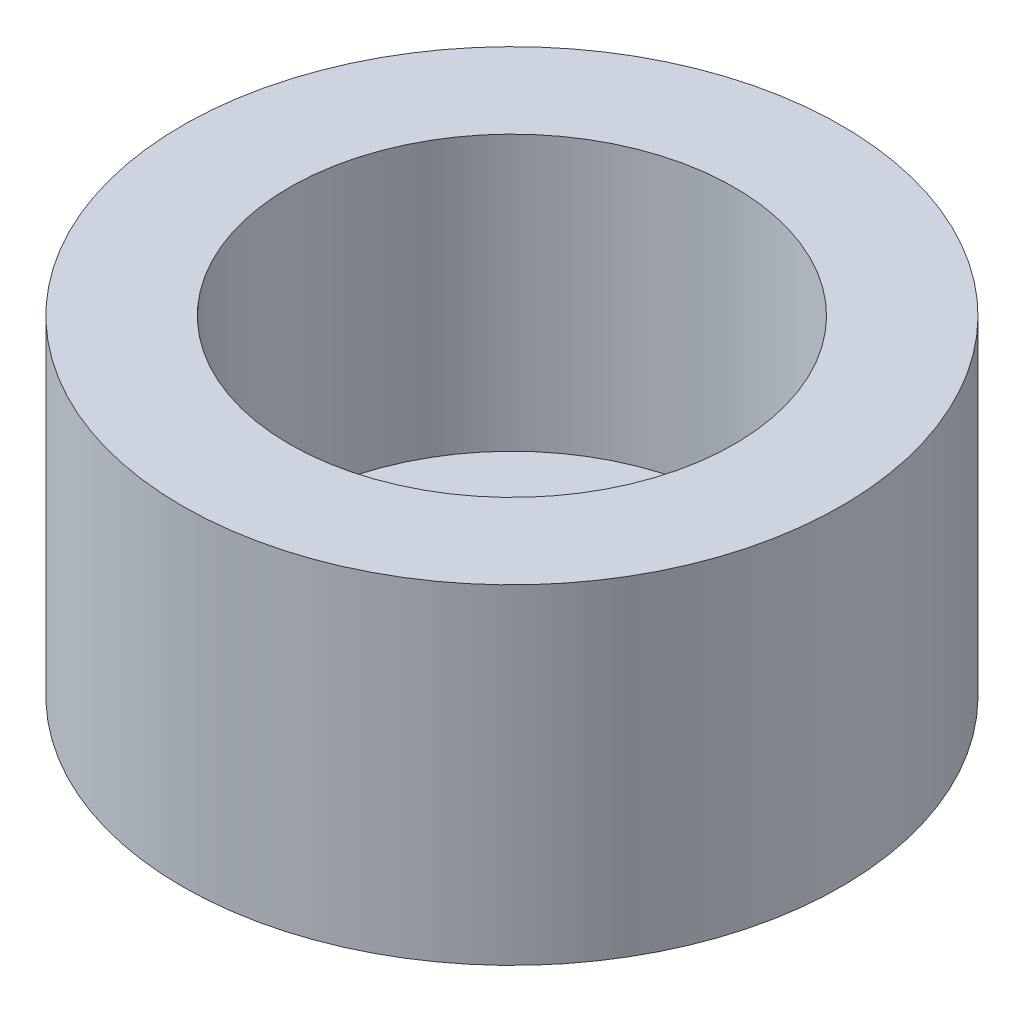
ISO-10303-21;
HEADER;
FILE_DESCRIPTION(('STEP AP214'),'2;1');
FILE_NAME('part.step','',(''),(''),'','','');
FILE_SCHEMA(('AUTOMOTIVE_DESIGN { 1 0 10303 214 1 1 1 1 }'));
ENDSEC;
DATA;
#1=APPLICATION_CONTEXT('core data for automotive mechanical design processes');
#2=APPLICATION_PROTOCOL_DEFINITION('international standard','automotive_design',2000,#1);
#3=PRODUCT_CONTEXT('',#1,'mechanical');
#4=PRODUCT('Part','Part','',(#3));
#5=PRODUCT_RELATED_PRODUCT_CATEGORY('part','',(#4));
#6=PRODUCT_DEFINITION_FORMATION('','',#4);
#7=PRODUCT_DEFINITION_CONTEXT('part definition',#1,'design');
#8=PRODUCT_DEFINITION('design','',#6,#7);
#9=PRODUCT_DEFINITION_SHAPE('','',#8);
#10=(LENGTH_UNIT() NAMED_UNIT(*) SI_UNIT(.MILLI.,.METRE.));
#11=(NAMED_UNIT(*) PLANE_ANGLE_UNIT() SI_UNIT($,.RADIAN.));
#12=(NAMED_UNIT(*) SI_UNIT($,.STERADIAN.) SOLID_ANGLE_UNIT());
#13=UNCERTAINTY_MEASURE_WITH_UNIT(LENGTH_MEASURE(1.E-05),#10,'distance_accuracy_value','');
#14=(GEOMETRIC_REPRESENTATION_CONTEXT(3) GLOBAL_UNCERTAINTY_ASSIGNED_CONTEXT((#13)) GLOBAL_UNIT_ASSIGNED_CONTEXT((#10,
#11,#12)) REPRESENTATION_CONTEXT('',''));
#15=CARTESIAN_POINT('',(0.,0.,0.));
#16=DIRECTION('',(0.,0.,1.));
#17=DIRECTION('',(1.,0.,0.));
#18=AXIS2_PLACEMENT_3D('',#15,#16,#17);
#19=CARTESIAN_POINT('',(0.,1.,0.));
#20=DIRECTION('',(0.,1.,0.));
#21=DIRECTION('',(0.,0.,1.));
#22=AXIS2_PLACEMENT_3D('',#19,#20,#21);
#23=PLANE('',#22);
#24=CARTESIAN_POINT('',(0.,1.,0.));
#25=DIRECTION('',(0.,1.,0.));
#26=DIRECTION('',(0.,0.,1.));
#27=AXIS2_PLACEMENT_3D('',#24,#25,#26);
#28=CIRCLE('',#27,1.75);
#29=CARTESIAN_POINT('',(0.,1.,1.75));
#30=VERTEX_POINT('',#29);
#31=EDGE_CURVE('E48',#30,#30,#28,.T.);
#32=ORIENTED_EDGE('',*,*,#31,.F.);
#33=EDGE_LOOP('',(#32));
#34=FACE_BOUND('',#33,.T.);
#35=CARTESIAN_POINT('',(0.,1.,0.));
#36=DIRECTION('',(0.,1.,0.));
#37=DIRECTION('',(0.,0.,1.));
#38=AXIS2_PLACEMENT_3D('',#35,#36,#37);
#39=CIRCLE('',#38,4.05);
#40=CARTESIAN_POINT('',(0.,1.,4.05));
#41=VERTEX_POINT('',#40);
#42=EDGE_CURVE('E62',#41,#41,#39,.T.);
#43=ORIENTED_EDGE('',*,*,#42,.T.);
#44=EDGE_LOOP('',(#43));
#45=FACE_BOUND('',#44,.T.);
#46=ADVANCED_FACE('F41',(#34,#45),#23,.T.);
#47=CARTESIAN_POINT('',(0.,0.,0.));
#48=DIRECTION('',(0.,1.,0.));
#49=DIRECTION('',(0.,0.,1.));
#50=AXIS2_PLACEMENT_3D('',#47,#48,#49);
#51=PLANE('',#50);
#52=CARTESIAN_POINT('',(0.,0.,0.));
#53=DIRECTION('',(0.,1.,0.));
#54=DIRECTION('',(0.,0.,1.));
#55=AXIS2_PLACEMENT_3D('',#52,#53,#54);
#56=CIRCLE('',#55,6.);
#57=CARTESIAN_POINT('',(0.,0.,6.));
#58=VERTEX_POINT('',#57);
#59=EDGE_CURVE('E10',#58,#58,#56,.T.);
#60=ORIENTED_EDGE('',*,*,#59,.F.);
#61=EDGE_LOOP('',(#60));
#62=FACE_BOUND('',#61,.T.);
#63=CARTESIAN_POINT('',(0.,0.,0.));
#64=DIRECTION('',(0.,1.,0.));
#65=DIRECTION('',(0.,0.,1.));
#66=AXIS2_PLACEMENT_3D('',#63,#64,#65);
#67=CIRCLE('',#66,1.75);
#68=CARTESIAN_POINT('',(0.,0.,1.75));
#69=VERTEX_POINT('',#68);
#70=EDGE_CURVE('E52',#69,#69,#67,.T.);
#71=ORIENTED_EDGE('',*,*,#70,.T.);
#72=EDGE_LOOP('',(#71));
#73=FACE_BOUND('',#72,.T.);
#74=ADVANCED_FACE('F84',(#62,#73),#51,.F.);
#75=CARTESIAN_POINT('',(0.,1.,0.));
#76=DIRECTION('',(0.,-1.,0.));
#77=DIRECTION('',(0.,0.,-1.));
#78=AXIS2_PLACEMENT_3D('',#75,#76,#77);
#79=CYLINDRICAL_SURFACE('',#78,6.);
#80=ORIENTED_EDGE('',*,*,#59,.T.);
#81=EDGE_LOOP('',(#80));
#82=FACE_BOUND('',#81,.T.);
#83=CARTESIAN_POINT('',(0.,6.,0.));
#84=DIRECTION('',(0.,1.,0.));
#85=DIRECTION('',(0.,0.,1.));
#86=AXIS2_PLACEMENT_3D('',#83,#84,#85);
#87=CIRCLE('',#86,6.);
#88=CARTESIAN_POINT('',(0.,6.,6.));
#89=VERTEX_POINT('',#88);
#90=EDGE_CURVE('E57',#89,#89,#87,.T.);
#91=ORIENTED_EDGE('',*,*,#90,.F.);
#92=EDGE_LOOP('',(#91));
#93=FACE_BOUND('',#92,.T.);
#94=ADVANCED_FACE('F43',(#82,#93),#79,.T.);
#95=CARTESIAN_POINT('',(0.,1.,0.));
#96=DIRECTION('',(0.,-1.,0.));
#97=DIRECTION('',(0.,0.,-1.));
#98=AXIS2_PLACEMENT_3D('',#95,#96,#97);
#99=CYLINDRICAL_SURFACE('',#98,1.75);
#100=ORIENTED_EDGE('',*,*,#31,.T.);
#101=EDGE_LOOP('',(#100));
#102=FACE_BOUND('',#101,.T.);
#103=ORIENTED_EDGE('',*,*,#70,.F.);
#104=EDGE_LOOP('',(#103));
#105=FACE_BOUND('',#104,.T.);
#106=ADVANCED_FACE('F73',(#102,#105),#99,.F.);
#107=CARTESIAN_POINT('',(0.,6.,0.));
#108=DIRECTION('',(0.,1.,0.));
#109=DIRECTION('',(0.,0.,1.));
#110=AXIS2_PLACEMENT_3D('',#107,#108,#109);
#111=PLANE('',#110);
#112=ORIENTED_EDGE('',*,*,#90,.T.);
#113=EDGE_LOOP('',(#112));
#114=FACE_BOUND('',#113,.T.);
#115=CARTESIAN_POINT('',(0.,6.,0.));
#116=DIRECTION('',(0.,1.,0.));
#117=DIRECTION('',(0.,0.,1.));
#118=AXIS2_PLACEMENT_3D('',#115,#116,#117);
#119=CIRCLE('',#118,4.05);
#120=CARTESIAN_POINT('',(0.,6.,4.05));
#121=VERTEX_POINT('',#120);
#122=EDGE_CURVE('E61',#121,#121,#119,.T.);
#123=ORIENTED_EDGE('',*,*,#122,.F.);
#124=EDGE_LOOP('',(#123));
#125=FACE_BOUND('',#124,.T.);
#126=ADVANCED_FACE('F71',(#114,#125),#111,.T.);
#127=CARTESIAN_POINT('',(0.,6.,0.));
#128=DIRECTION('',(0.,-1.,0.));
#129=DIRECTION('',(0.,0.,-1.));
#130=AXIS2_PLACEMENT_3D('',#127,#128,#129);
#131=CYLINDRICAL_SURFACE('',#130,4.05);
#132=ORIENTED_EDGE('',*,*,#122,.T.);
#133=EDGE_LOOP('',(#132));
#134=FACE_BOUND('',#133,.T.);
#135=ORIENTED_EDGE('',*,*,#42,.F.);
#136=EDGE_LOOP('',(#135));
#137=FACE_BOUND('',#136,.T.);
#138=ADVANCED_FACE('F68',(#134,#137),#131,.F.);
#139=CLOSED_SHELL('',(#46,#74,#94,#106,#126,#138));
#140=MANIFOLD_SOLID_BREP('B2',#139);
#141=ADVANCED_BREP_SHAPE_REPRESENTATION('',(#18,#140),#14);
#142=SHAPE_DEFINITION_REPRESENTATION(#9,#141);
ENDSEC;
END-ISO-10303-21;
